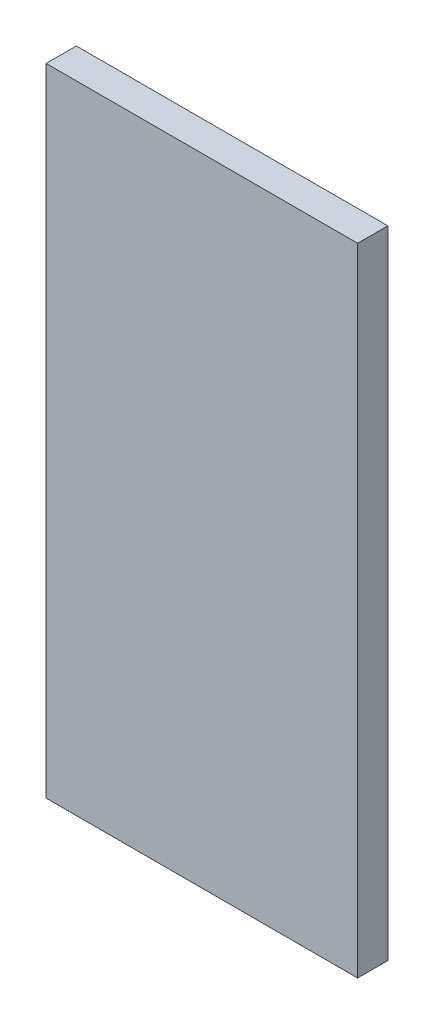
ISO-10303-21;
HEADER;
FILE_DESCRIPTION(('STEP AP214'),'2;1');
FILE_NAME('part.step','',(''),(''),'','','');
FILE_SCHEMA(('AUTOMOTIVE_DESIGN { 1 0 10303 214 1 1 1 1 }'));
ENDSEC;
DATA;
#1=APPLICATION_CONTEXT('core data for automotive mechanical design processes');
#2=APPLICATION_PROTOCOL_DEFINITION('international standard','automotive_design',2000,#1);
#3=PRODUCT_CONTEXT('',#1,'mechanical');
#4=PRODUCT('Part','Part','',(#3));
#5=PRODUCT_RELATED_PRODUCT_CATEGORY('part','',(#4));
#6=PRODUCT_DEFINITION_FORMATION('','',#4);
#7=PRODUCT_DEFINITION_CONTEXT('part definition',#1,'design');
#8=PRODUCT_DEFINITION('design','',#6,#7);
#9=PRODUCT_DEFINITION_SHAPE('','',#8);
#10=(LENGTH_UNIT() NAMED_UNIT(*) SI_UNIT(.MILLI.,.METRE.));
#11=(NAMED_UNIT(*) PLANE_ANGLE_UNIT() SI_UNIT($,.RADIAN.));
#12=(NAMED_UNIT(*) SI_UNIT($,.STERADIAN.) SOLID_ANGLE_UNIT());
#13=UNCERTAINTY_MEASURE_WITH_UNIT(LENGTH_MEASURE(1.E-05),#10,'distance_accuracy_value','');
#14=(GEOMETRIC_REPRESENTATION_CONTEXT(3) GLOBAL_UNCERTAINTY_ASSIGNED_CONTEXT((#13)) GLOBAL_UNIT_ASSIGNED_CONTEXT((#10,
#11,#12)) REPRESENTATION_CONTEXT('',''));
#15=CARTESIAN_POINT('',(0.,0.,0.));
#16=DIRECTION('',(0.,0.,1.));
#17=DIRECTION('',(1.,0.,0.));
#18=AXIS2_PLACEMENT_3D('',#15,#16,#17);
#19=CARTESIAN_POINT('',(0.,0.,47.5));
#20=DIRECTION('',(1.,0.,0.));
#21=DIRECTION('',(0.,0.,-1.));
#22=AXIS2_PLACEMENT_3D('',#19,#20,#21);
#23=PLANE('',#22);
#24=DIRECTION('',(0.,-1.,0.));
#25=VECTOR('',#24,1.);
#26=CARTESIAN_POINT('',(0.,0.,0.));
#27=LINE('',#26,#25);
#28=CARTESIAN_POINT('',(0.,1001.,0.));
#29=VERTEX_POINT('',#28);
#30=CARTESIAN_POINT('',(0.,0.,0.));
#31=VERTEX_POINT('',#30);
#32=EDGE_CURVE('E107',#29,#31,#27,.T.);
#33=ORIENTED_EDGE('',*,*,#32,.T.);
#34=DIRECTION('',(0.,0.,-1.));
#35=VECTOR('',#34,1.);
#36=CARTESIAN_POINT('',(0.,0.,47.5));
#37=LINE('',#36,#35);
#38=CARTESIAN_POINT('',(0.,0.,47.5));
#39=VERTEX_POINT('',#38);
#40=EDGE_CURVE('E11',#39,#31,#37,.T.);
#41=ORIENTED_EDGE('',*,*,#40,.F.);
#42=DIRECTION('',(0.,-1.,0.));
#43=VECTOR('',#42,1.);
#44=CARTESIAN_POINT('',(0.,0.,47.5));
#45=LINE('',#44,#43);
#46=CARTESIAN_POINT('',(0.,1001.,47.5));
#47=VERTEX_POINT('',#46);
#48=EDGE_CURVE('E91',#47,#39,#45,.T.);
#49=ORIENTED_EDGE('',*,*,#48,.F.);
#50=DIRECTION('',(0.,0.,-1.));
#51=VECTOR('',#50,1.);
#52=CARTESIAN_POINT('',(0.,1001.,47.5));
#53=LINE('',#52,#51);
#54=EDGE_CURVE('E103',#47,#29,#53,.T.);
#55=ORIENTED_EDGE('',*,*,#54,.T.);
#56=EDGE_LOOP('',(#33,#41,#49,#55));
#57=FACE_BOUND('',#56,.T.);
#58=ADVANCED_FACE('F39',(#57),#23,.F.);
#59=CARTESIAN_POINT('',(0.,0.,47.5));
#60=DIRECTION('',(0.,1.,0.));
#61=DIRECTION('',(0.,0.,1.));
#62=AXIS2_PLACEMENT_3D('',#59,#60,#61);
#63=PLANE('',#62);
#64=DIRECTION('',(1.,0.,0.));
#65=VECTOR('',#64,1.);
#66=CARTESIAN_POINT('',(0.,0.,0.));
#67=LINE('',#66,#65);
#68=CARTESIAN_POINT('',(490.,0.,0.));
#69=VERTEX_POINT('',#68);
#70=EDGE_CURVE('E96',#31,#69,#67,.T.);
#71=ORIENTED_EDGE('',*,*,#70,.T.);
#72=DIRECTION('',(0.,0.,-1.));
#73=VECTOR('',#72,1.);
#74=CARTESIAN_POINT('',(490.,0.,47.5));
#75=LINE('',#74,#73);
#76=CARTESIAN_POINT('',(490.,0.,47.5));
#77=VERTEX_POINT('',#76);
#78=EDGE_CURVE('E48',#77,#69,#75,.T.);
#79=ORIENTED_EDGE('',*,*,#78,.F.);
#80=DIRECTION('',(1.,0.,0.));
#81=VECTOR('',#80,1.);
#82=CARTESIAN_POINT('',(0.,0.,47.5));
#83=LINE('',#82,#81);
#84=EDGE_CURVE('E86',#39,#77,#83,.T.);
#85=ORIENTED_EDGE('',*,*,#84,.F.);
#86=ORIENTED_EDGE('',*,*,#40,.T.);
#87=EDGE_LOOP('',(#71,#79,#85,#86));
#88=FACE_BOUND('',#87,.T.);
#89=ADVANCED_FACE('F95',(#88),#63,.F.);
#90=CARTESIAN_POINT('',(490.,0.,47.5));
#91=DIRECTION('',(-1.,0.,0.));
#92=DIRECTION('',(0.,-1.,0.));
#93=AXIS2_PLACEMENT_3D('',#90,#91,#92);
#94=PLANE('',#93);
#95=DIRECTION('',(0.,1.,0.));
#96=VECTOR('',#95,1.);
#97=CARTESIAN_POINT('',(490.,0.,0.));
#98=LINE('',#97,#96);
#99=CARTESIAN_POINT('',(490.,1001.,0.));
#100=VERTEX_POINT('',#99);
#101=EDGE_CURVE('E73',#69,#100,#98,.T.);
#102=ORIENTED_EDGE('',*,*,#101,.T.);
#103=DIRECTION('',(0.,0.,-1.));
#104=VECTOR('',#103,1.);
#105=CARTESIAN_POINT('',(490.,1001.,47.5));
#106=LINE('',#105,#104);
#107=CARTESIAN_POINT('',(490.,1001.,47.5));
#108=VERTEX_POINT('',#107);
#109=EDGE_CURVE('E98',#108,#100,#106,.T.);
#110=ORIENTED_EDGE('',*,*,#109,.F.);
#111=DIRECTION('',(0.,1.,0.));
#112=VECTOR('',#111,1.);
#113=CARTESIAN_POINT('',(490.,0.,47.5));
#114=LINE('',#113,#112);
#115=EDGE_CURVE('E89',#77,#108,#114,.T.);
#116=ORIENTED_EDGE('',*,*,#115,.F.);
#117=ORIENTED_EDGE('',*,*,#78,.T.);
#118=EDGE_LOOP('',(#102,#110,#116,#117));
#119=FACE_BOUND('',#118,.T.);
#120=ADVANCED_FACE('F99',(#119),#94,.F.);
#121=CARTESIAN_POINT('',(0.,1001.,47.5));
#122=DIRECTION('',(0.,-1.,0.));
#123=DIRECTION('',(0.,0.,-1.));
#124=AXIS2_PLACEMENT_3D('',#121,#122,#123);
#125=PLANE('',#124);
#126=DIRECTION('',(-1.,0.,0.));
#127=VECTOR('',#126,1.);
#128=CARTESIAN_POINT('',(0.,1001.,0.));
#129=LINE('',#128,#127);
#130=EDGE_CURVE('E79',#100,#29,#129,.T.);
#131=ORIENTED_EDGE('',*,*,#130,.T.);
#132=ORIENTED_EDGE('',*,*,#54,.F.);
#133=DIRECTION('',(-1.,0.,0.));
#134=VECTOR('',#133,1.);
#135=CARTESIAN_POINT('',(0.,1001.,47.5));
#136=LINE('',#135,#134);
#137=EDGE_CURVE('E56',#108,#47,#136,.T.);
#138=ORIENTED_EDGE('',*,*,#137,.F.);
#139=ORIENTED_EDGE('',*,*,#109,.T.);
#140=EDGE_LOOP('',(#131,#132,#138,#139));
#141=FACE_BOUND('',#140,.T.);
#142=ADVANCED_FACE('F120',(#141),#125,.F.);
#143=CARTESIAN_POINT('',(0.,0.,47.5));
#144=DIRECTION('',(0.,0.,-1.));
#145=DIRECTION('',(-1.,0.,0.));
#146=AXIS2_PLACEMENT_3D('',#143,#144,#145);
#147=PLANE('',#146);
#148=ORIENTED_EDGE('',*,*,#48,.T.);
#149=ORIENTED_EDGE('',*,*,#84,.T.);
#150=ORIENTED_EDGE('',*,*,#115,.T.);
#151=ORIENTED_EDGE('',*,*,#137,.T.);
#152=EDGE_LOOP('',(#148,#149,#150,#151));
#153=FACE_BOUND('',#152,.T.);
#154=ADVANCED_FACE('F87',(#153),#147,.F.);
#155=CARTESIAN_POINT('',(0.,0.,0.));
#156=DIRECTION('',(0.,0.,-1.));
#157=DIRECTION('',(-1.,0.,0.));
#158=AXIS2_PLACEMENT_3D('',#155,#156,#157);
#159=PLANE('',#158);
#160=ORIENTED_EDGE('',*,*,#32,.F.);
#161=ORIENTED_EDGE('',*,*,#130,.F.);
#162=ORIENTED_EDGE('',*,*,#101,.F.);
#163=ORIENTED_EDGE('',*,*,#70,.F.);
#164=EDGE_LOOP('',(#160,#161,#162,#163));
#165=FACE_BOUND('',#164,.T.);
#166=ADVANCED_FACE('F123',(#165),#159,.T.);
#167=CLOSED_SHELL('',(#58,#89,#120,#142,#154,#166));
#168=MANIFOLD_SOLID_BREP('B2',#167);
#169=ADVANCED_BREP_SHAPE_REPRESENTATION('',(#18,#168),#14);
#170=SHAPE_DEFINITION_REPRESENTATION(#9,#169);
ENDSEC;
END-ISO-10303-21;
